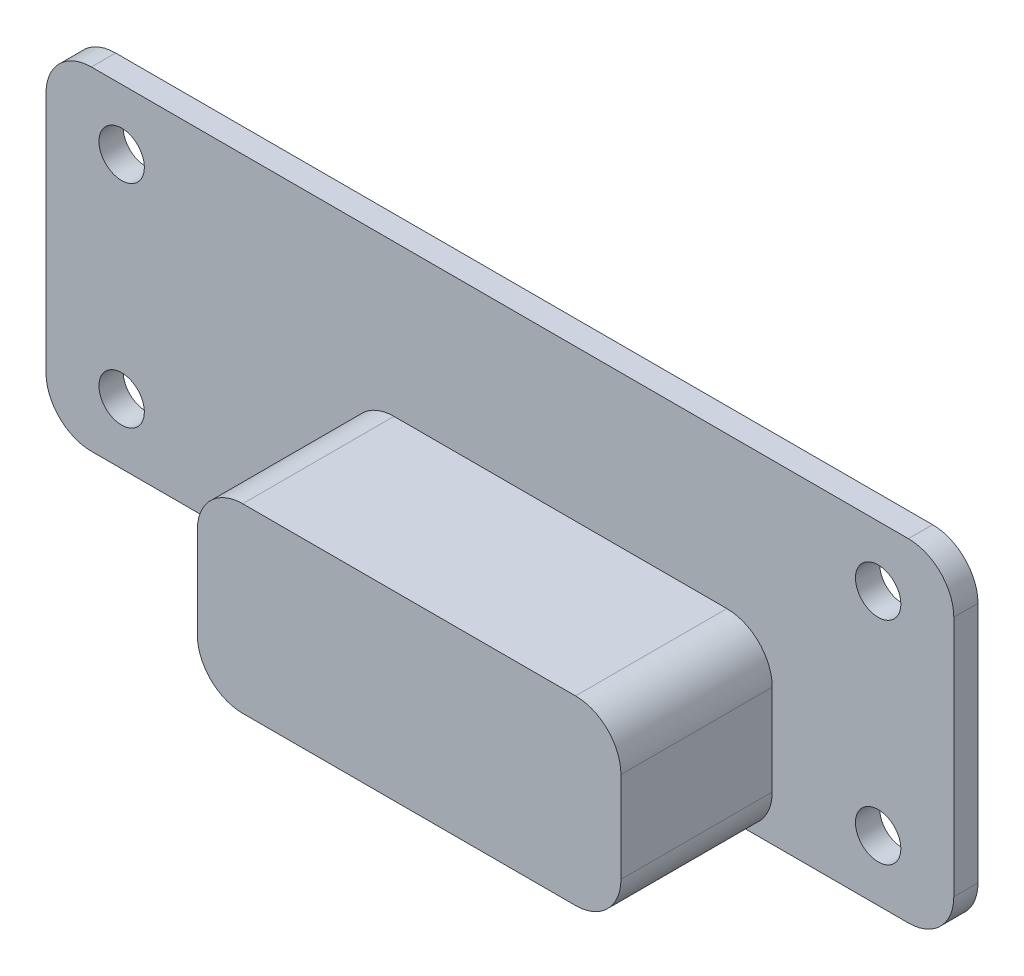
ISO-10303-21;
HEADER;
FILE_DESCRIPTION(('STEP AP214'),'2;1');
FILE_NAME('part.step','',(''),(''),'','','');
FILE_SCHEMA(('AUTOMOTIVE_DESIGN { 1 0 10303 214 1 1 1 1 }'));
ENDSEC;
DATA;
#1=APPLICATION_CONTEXT('core data for automotive mechanical design processes');
#2=APPLICATION_PROTOCOL_DEFINITION('international standard','automotive_design',2000,#1);
#3=PRODUCT_CONTEXT('',#1,'mechanical');
#4=PRODUCT('Part','Part','',(#3));
#5=PRODUCT_RELATED_PRODUCT_CATEGORY('part','',(#4));
#6=PRODUCT_DEFINITION_FORMATION('','',#4);
#7=PRODUCT_DEFINITION_CONTEXT('part definition',#1,'design');
#8=PRODUCT_DEFINITION('design','',#6,#7);
#9=PRODUCT_DEFINITION_SHAPE('','',#8);
#10=(LENGTH_UNIT() NAMED_UNIT(*) SI_UNIT(.MILLI.,.METRE.));
#11=(NAMED_UNIT(*) PLANE_ANGLE_UNIT() SI_UNIT($,.RADIAN.));
#12=(NAMED_UNIT(*) SI_UNIT($,.STERADIAN.) SOLID_ANGLE_UNIT());
#13=UNCERTAINTY_MEASURE_WITH_UNIT(LENGTH_MEASURE(1.E-05),#10,'distance_accuracy_value','');
#14=(GEOMETRIC_REPRESENTATION_CONTEXT(3) GLOBAL_UNCERTAINTY_ASSIGNED_CONTEXT((#13)) GLOBAL_UNIT_ASSIGNED_CONTEXT((#10,
#11,#12)) REPRESENTATION_CONTEXT('',''));
#15=CARTESIAN_POINT('',(0.,0.,0.));
#16=DIRECTION('',(0.,0.,1.));
#17=DIRECTION('',(1.,0.,0.));
#18=AXIS2_PLACEMENT_3D('',#15,#16,#17);
#19=CARTESIAN_POINT('',(-27.,8.,1.6));
#20=DIRECTION('',(0.,0.,1.));
#21=DIRECTION('',(1.,0.,0.));
#22=AXIS2_PLACEMENT_3D('',#19,#20,#21);
#23=PLANE('',#22);
#24=DIRECTION('',(0.,-1.,0.));
#25=VECTOR('',#24,1.);
#26=CARTESIAN_POINT('',(-10.,-11.,1.6));
#27=LINE('',#26,#25);
#28=CARTESIAN_POINT('',(-10.,-2.,1.6));
#29=VERTEX_POINT('',#28);
#30=CARTESIAN_POINT('',(-10.,-7.99999999999999,1.6));
#31=VERTEX_POINT('',#30);
#32=EDGE_CURVE('E229',#29,#31,#27,.T.);
#33=ORIENTED_EDGE('',*,*,#32,.F.);
#34=CARTESIAN_POINT('',(-7.00000000000001,-2.,1.6));
#35=DIRECTION('',(0.,0.,1.));
#36=DIRECTION('',(1.,0.,0.));
#37=AXIS2_PLACEMENT_3D('',#34,#35,#36);
#38=CIRCLE('',#37,3.);
#39=CARTESIAN_POINT('',(-7.00000000000001,0.999999999999997,1.6));
#40=VERTEX_POINT('',#39);
#41=EDGE_CURVE('E11',#29,#40,#38,.F.);
#42=ORIENTED_EDGE('',*,*,#41,.T.);
#43=DIRECTION('',(-1.,0.,0.));
#44=VECTOR('',#43,1.);
#45=CARTESIAN_POINT('',(-10.,0.999999999999997,1.6));
#46=LINE('',#45,#44);
#47=CARTESIAN_POINT('',(15.,0.999999999999997,1.6));
#48=VERTEX_POINT('',#47);
#49=EDGE_CURVE('E220',#48,#40,#46,.T.);
#50=ORIENTED_EDGE('',*,*,#49,.F.);
#51=CARTESIAN_POINT('',(15.,-2.,1.6));
#52=DIRECTION('',(0.,0.,1.));
#53=DIRECTION('',(1.,0.,0.));
#54=AXIS2_PLACEMENT_3D('',#51,#52,#53);
#55=CIRCLE('',#54,3.);
#56=CARTESIAN_POINT('',(18.,-2.,1.6));
#57=VERTEX_POINT('',#56);
#58=EDGE_CURVE('E214',#48,#57,#55,.F.);
#59=ORIENTED_EDGE('',*,*,#58,.T.);
#60=DIRECTION('',(0.,1.,0.));
#61=VECTOR('',#60,1.);
#62=CARTESIAN_POINT('',(18.,-11.,1.6));
#63=LINE('',#62,#61);
#64=CARTESIAN_POINT('',(18.,-7.99999999999999,1.6));
#65=VERTEX_POINT('',#64);
#66=EDGE_CURVE('E218',#65,#57,#63,.T.);
#67=ORIENTED_EDGE('',*,*,#66,.F.);
#68=CARTESIAN_POINT('',(15.,-7.99999999999999,1.6));
#69=DIRECTION('',(0.,0.,1.));
#70=DIRECTION('',(1.,0.,0.));
#71=AXIS2_PLACEMENT_3D('',#68,#69,#70);
#72=CIRCLE('',#71,3.);
#73=CARTESIAN_POINT('',(15.,-11.,1.6));
#74=VERTEX_POINT('',#73);
#75=EDGE_CURVE('E211',#65,#74,#72,.F.);
#76=ORIENTED_EDGE('',*,*,#75,.T.);
#77=DIRECTION('',(1.,0.,0.));
#78=VECTOR('',#77,1.);
#79=CARTESIAN_POINT('',(-27.,-11.,1.6));
#80=LINE('',#79,#78);
#81=CARTESIAN_POINT('',(27.,-11.,1.6));
#82=VERTEX_POINT('',#81);
#83=EDGE_CURVE('E276',#74,#82,#80,.T.);
#84=ORIENTED_EDGE('',*,*,#83,.T.);
#85=CARTESIAN_POINT('',(27.,-7.99999999999999,1.6));
#86=DIRECTION('',(0.,0.,1.));
#87=DIRECTION('',(1.,0.,0.));
#88=AXIS2_PLACEMENT_3D('',#85,#86,#87);
#89=CIRCLE('',#88,3.);
#90=CARTESIAN_POINT('',(30.,-7.99999999999999,1.6));
#91=VERTEX_POINT('',#90);
#92=EDGE_CURVE('E279',#82,#91,#89,.T.);
#93=ORIENTED_EDGE('',*,*,#92,.T.);
#94=DIRECTION('',(0.,1.,0.));
#95=VECTOR('',#94,1.);
#96=CARTESIAN_POINT('',(30.,-8.00000000000001,1.6));
#97=LINE('',#96,#95);
#98=CARTESIAN_POINT('',(30.,8.00000000000001,1.6));
#99=VERTEX_POINT('',#98);
#100=EDGE_CURVE('E281',#91,#99,#97,.T.);
#101=ORIENTED_EDGE('',*,*,#100,.T.);
#102=CARTESIAN_POINT('',(27.,8.00000000000001,1.6));
#103=DIRECTION('',(0.,0.,1.));
#104=DIRECTION('',(1.,0.,0.));
#105=AXIS2_PLACEMENT_3D('',#102,#103,#104);
#106=CIRCLE('',#105,3.);
#107=CARTESIAN_POINT('',(27.,11.,1.6));
#108=VERTEX_POINT('',#107);
#109=EDGE_CURVE('E283',#99,#108,#106,.T.);
#110=ORIENTED_EDGE('',*,*,#109,.T.);
#111=DIRECTION('',(-1.,0.,0.));
#112=VECTOR('',#111,1.);
#113=CARTESIAN_POINT('',(27.,11.,1.6));
#114=LINE('',#113,#112);
#115=CARTESIAN_POINT('',(-27.,11.,1.6));
#116=VERTEX_POINT('',#115);
#117=EDGE_CURVE('E170',#108,#116,#114,.T.);
#118=ORIENTED_EDGE('',*,*,#117,.T.);
#119=CARTESIAN_POINT('',(-27.,8.,1.6));
#120=DIRECTION('',(0.,0.,1.));
#121=DIRECTION('',(1.,0.,0.));
#122=AXIS2_PLACEMENT_3D('',#119,#120,#121);
#123=CIRCLE('',#122,3.);
#124=CARTESIAN_POINT('',(-30.,8.,1.6));
#125=VERTEX_POINT('',#124);
#126=EDGE_CURVE('E165',#116,#125,#123,.T.);
#127=ORIENTED_EDGE('',*,*,#126,.T.);
#128=DIRECTION('',(0.,-1.,0.));
#129=VECTOR('',#128,1.);
#130=CARTESIAN_POINT('',(-30.,8.,1.6));
#131=LINE('',#130,#129);
#132=CARTESIAN_POINT('',(-30.,-8.00000000000001,1.6));
#133=VERTEX_POINT('',#132);
#134=EDGE_CURVE('E155',#125,#133,#131,.T.);
#135=ORIENTED_EDGE('',*,*,#134,.T.);
#136=CARTESIAN_POINT('',(-27.,-8.,1.6));
#137=DIRECTION('',(0.,0.,1.));
#138=DIRECTION('',(1.,0.,0.));
#139=AXIS2_PLACEMENT_3D('',#136,#137,#138);
#140=CIRCLE('',#139,3.);
#141=CARTESIAN_POINT('',(-27.,-11.,1.6));
#142=VERTEX_POINT('',#141);
#143=EDGE_CURVE('E164',#133,#142,#140,.T.);
#144=ORIENTED_EDGE('',*,*,#143,.T.);
#145=CARTESIAN_POINT('',(-7.00000000000001,-11.,1.6));
#146=VERTEX_POINT('',#145);
#147=EDGE_CURVE('E277',#142,#146,#80,.T.);
#148=ORIENTED_EDGE('',*,*,#147,.T.);
#149=CARTESIAN_POINT('',(-7.00000000000001,-7.99999999999999,1.6));
#150=DIRECTION('',(0.,0.,1.));
#151=DIRECTION('',(1.,0.,0.));
#152=AXIS2_PLACEMENT_3D('',#149,#150,#151);
#153=CIRCLE('',#152,3.);
#154=EDGE_CURVE('E51',#146,#31,#153,.F.);
#155=ORIENTED_EDGE('',*,*,#154,.T.);
#156=EDGE_LOOP('',(#33,#42,#50,#59,#67,#76,#84,#93,#101,#110,#118,#127,#135,#144,#148,#155));
#157=FACE_BOUND('',#156,.T.);
#158=CARTESIAN_POINT('',(25.,-7.,1.6));
#159=DIRECTION('',(0.,0.,1.));
#160=DIRECTION('',(1.,0.,0.));
#161=AXIS2_PLACEMENT_3D('',#158,#159,#160);
#162=CIRCLE('',#161,1.5);
#163=CARTESIAN_POINT('',(26.5,-7.,1.6));
#164=VERTEX_POINT('',#163);
#165=EDGE_CURVE('E258',#164,#164,#162,.T.);
#166=ORIENTED_EDGE('',*,*,#165,.F.);
#167=EDGE_LOOP('',(#166));
#168=FACE_BOUND('',#167,.T.);
#169=CARTESIAN_POINT('',(-25.,7.,1.6));
#170=DIRECTION('',(0.,0.,1.));
#171=DIRECTION('',(1.,0.,0.));
#172=AXIS2_PLACEMENT_3D('',#169,#170,#171);
#173=CIRCLE('',#172,1.5);
#174=CARTESIAN_POINT('',(-23.5,7.,1.6));
#175=VERTEX_POINT('',#174);
#176=EDGE_CURVE('E270',#175,#175,#173,.T.);
#177=ORIENTED_EDGE('',*,*,#176,.F.);
#178=EDGE_LOOP('',(#177));
#179=FACE_BOUND('',#178,.T.);
#180=CARTESIAN_POINT('',(25.,7.,1.6));
#181=DIRECTION('',(0.,0.,1.));
#182=DIRECTION('',(1.,0.,0.));
#183=AXIS2_PLACEMENT_3D('',#180,#181,#182);
#184=CIRCLE('',#183,1.5);
#185=CARTESIAN_POINT('',(26.5,7.,1.6));
#186=VERTEX_POINT('',#185);
#187=EDGE_CURVE('E264',#186,#186,#184,.T.);
#188=ORIENTED_EDGE('',*,*,#187,.F.);
#189=EDGE_LOOP('',(#188));
#190=FACE_BOUND('',#189,.T.);
#191=CARTESIAN_POINT('',(-25.,-7.,1.6));
#192=DIRECTION('',(0.,0.,1.));
#193=DIRECTION('',(1.,0.,0.));
#194=AXIS2_PLACEMENT_3D('',#191,#192,#193);
#195=CIRCLE('',#194,1.5);
#196=CARTESIAN_POINT('',(-23.5,-7.,1.6));
#197=VERTEX_POINT('',#196);
#198=EDGE_CURVE('E246',#197,#197,#195,.T.);
#199=ORIENTED_EDGE('',*,*,#198,.F.);
#200=EDGE_LOOP('',(#199));
#201=FACE_BOUND('',#200,.T.);
#202=ADVANCED_FACE('F43',(#157,#168,#179,#190,#201),#23,.T.);
#203=CARTESIAN_POINT('',(-27.,8.,0.));
#204=DIRECTION('',(0.,0.,1.));
#205=DIRECTION('',(1.,0.,0.));
#206=AXIS2_PLACEMENT_3D('',#203,#204,#205);
#207=PLANE('',#206);
#208=CARTESIAN_POINT('',(-27.,8.,0.));
#209=DIRECTION('',(0.,0.,1.));
#210=DIRECTION('',(1.,0.,0.));
#211=AXIS2_PLACEMENT_3D('',#208,#209,#210);
#212=CIRCLE('',#211,3.);
#213=CARTESIAN_POINT('',(-27.,11.,0.));
#214=VERTEX_POINT('',#213);
#215=CARTESIAN_POINT('',(-30.,8.,0.));
#216=VERTEX_POINT('',#215);
#217=EDGE_CURVE('E178',#214,#216,#212,.T.);
#218=ORIENTED_EDGE('',*,*,#217,.F.);
#219=DIRECTION('',(-1.,0.,0.));
#220=VECTOR('',#219,1.);
#221=CARTESIAN_POINT('',(27.,11.,0.));
#222=LINE('',#221,#220);
#223=CARTESIAN_POINT('',(27.,11.,0.));
#224=VERTEX_POINT('',#223);
#225=EDGE_CURVE('E174',#224,#214,#222,.T.);
#226=ORIENTED_EDGE('',*,*,#225,.F.);
#227=CARTESIAN_POINT('',(27.,8.00000000000001,0.));
#228=DIRECTION('',(0.,0.,1.));
#229=DIRECTION('',(1.,0.,0.));
#230=AXIS2_PLACEMENT_3D('',#227,#228,#229);
#231=CIRCLE('',#230,3.);
#232=CARTESIAN_POINT('',(30.,8.00000000000001,0.));
#233=VERTEX_POINT('',#232);
#234=EDGE_CURVE('E298',#233,#224,#231,.T.);
#235=ORIENTED_EDGE('',*,*,#234,.F.);
#236=DIRECTION('',(0.,1.,0.));
#237=VECTOR('',#236,1.);
#238=CARTESIAN_POINT('',(30.,-8.00000000000001,0.));
#239=LINE('',#238,#237);
#240=CARTESIAN_POINT('',(30.,-7.99999999999999,0.));
#241=VERTEX_POINT('',#240);
#242=EDGE_CURVE('E296',#241,#233,#239,.T.);
#243=ORIENTED_EDGE('',*,*,#242,.F.);
#244=CARTESIAN_POINT('',(27.,-7.99999999999999,0.));
#245=DIRECTION('',(0.,0.,1.));
#246=DIRECTION('',(1.,0.,0.));
#247=AXIS2_PLACEMENT_3D('',#244,#245,#246);
#248=CIRCLE('',#247,3.);
#249=CARTESIAN_POINT('',(27.,-11.,0.));
#250=VERTEX_POINT('',#249);
#251=EDGE_CURVE('E294',#250,#241,#248,.T.);
#252=ORIENTED_EDGE('',*,*,#251,.F.);
#253=DIRECTION('',(1.,0.,0.));
#254=VECTOR('',#253,1.);
#255=CARTESIAN_POINT('',(-27.,-11.,0.));
#256=LINE('',#255,#254);
#257=CARTESIAN_POINT('',(-27.,-11.,0.));
#258=VERTEX_POINT('',#257);
#259=EDGE_CURVE('E292',#258,#250,#256,.T.);
#260=ORIENTED_EDGE('',*,*,#259,.F.);
#261=CARTESIAN_POINT('',(-27.,-8.,0.));
#262=DIRECTION('',(0.,0.,1.));
#263=DIRECTION('',(1.,0.,0.));
#264=AXIS2_PLACEMENT_3D('',#261,#262,#263);
#265=CIRCLE('',#264,3.);
#266=CARTESIAN_POINT('',(-30.,-8.00000000000001,0.));
#267=VERTEX_POINT('',#266);
#268=EDGE_CURVE('E290',#267,#258,#265,.T.);
#269=ORIENTED_EDGE('',*,*,#268,.F.);
#270=DIRECTION('',(0.,-1.,0.));
#271=VECTOR('',#270,1.);
#272=CARTESIAN_POINT('',(-30.,8.,0.));
#273=LINE('',#272,#271);
#274=EDGE_CURVE('E288',#216,#267,#273,.T.);
#275=ORIENTED_EDGE('',*,*,#274,.F.);
#276=EDGE_LOOP('',(#218,#226,#235,#243,#252,#260,#269,#275));
#277=FACE_BOUND('',#276,.T.);
#278=CARTESIAN_POINT('',(-25.,7.,0.));
#279=DIRECTION('',(0.,0.,1.));
#280=DIRECTION('',(1.,0.,0.));
#281=AXIS2_PLACEMENT_3D('',#278,#279,#280);
#282=CIRCLE('',#281,1.5);
#283=CARTESIAN_POINT('',(-23.5,7.,0.));
#284=VERTEX_POINT('',#283);
#285=EDGE_CURVE('E267',#284,#284,#282,.T.);
#286=ORIENTED_EDGE('',*,*,#285,.T.);
#287=EDGE_LOOP('',(#286));
#288=FACE_BOUND('',#287,.T.);
#289=CARTESIAN_POINT('',(25.,7.,0.));
#290=DIRECTION('',(0.,0.,1.));
#291=DIRECTION('',(1.,0.,0.));
#292=AXIS2_PLACEMENT_3D('',#289,#290,#291);
#293=CIRCLE('',#292,1.5);
#294=CARTESIAN_POINT('',(26.5,7.,0.));
#295=VERTEX_POINT('',#294);
#296=EDGE_CURVE('E261',#295,#295,#293,.T.);
#297=ORIENTED_EDGE('',*,*,#296,.T.);
#298=EDGE_LOOP('',(#297));
#299=FACE_BOUND('',#298,.T.);
#300=CARTESIAN_POINT('',(25.,-7.,0.));
#301=DIRECTION('',(0.,0.,1.));
#302=DIRECTION('',(1.,0.,0.));
#303=AXIS2_PLACEMENT_3D('',#300,#301,#302);
#304=CIRCLE('',#303,1.5);
#305=CARTESIAN_POINT('',(26.5,-7.,0.));
#306=VERTEX_POINT('',#305);
#307=EDGE_CURVE('E256',#306,#306,#304,.T.);
#308=ORIENTED_EDGE('',*,*,#307,.T.);
#309=EDGE_LOOP('',(#308));
#310=FACE_BOUND('',#309,.T.);
#311=CARTESIAN_POINT('',(-25.,-7.,0.));
#312=DIRECTION('',(0.,0.,1.));
#313=DIRECTION('',(1.,0.,0.));
#314=AXIS2_PLACEMENT_3D('',#311,#312,#313);
#315=CIRCLE('',#314,1.5);
#316=CARTESIAN_POINT('',(-23.5,-7.,0.));
#317=VERTEX_POINT('',#316);
#318=EDGE_CURVE('E243',#317,#317,#315,.T.);
#319=ORIENTED_EDGE('',*,*,#318,.T.);
#320=EDGE_LOOP('',(#319));
#321=FACE_BOUND('',#320,.T.);
#322=ADVANCED_FACE('F324',(#277,#288,#299,#310,#321),#207,.F.);
#323=CARTESIAN_POINT('',(-27.,8.,1.6));
#324=DIRECTION('',(0.,0.,-1.));
#325=DIRECTION('',(-1.,0.,0.));
#326=AXIS2_PLACEMENT_3D('',#323,#324,#325);
#327=CYLINDRICAL_SURFACE('',#326,3.);
#328=ORIENTED_EDGE('',*,*,#217,.T.);
#329=DIRECTION('',(0.,0.,-1.));
#330=VECTOR('',#329,1.);
#331=CARTESIAN_POINT('',(-30.,8.,1.6));
#332=LINE('',#331,#330);
#333=EDGE_CURVE('E159',#125,#216,#332,.T.);
#334=ORIENTED_EDGE('',*,*,#333,.F.);
#335=ORIENTED_EDGE('',*,*,#126,.F.);
#336=DIRECTION('',(0.,0.,-1.));
#337=VECTOR('',#336,1.);
#338=CARTESIAN_POINT('',(-27.,11.,1.6));
#339=LINE('',#338,#337);
#340=EDGE_CURVE('E286',#116,#214,#339,.T.);
#341=ORIENTED_EDGE('',*,*,#340,.T.);
#342=EDGE_LOOP('',(#328,#334,#335,#341));
#343=FACE_BOUND('',#342,.T.);
#344=ADVANCED_FACE('F176',(#343),#327,.T.);
#345=CARTESIAN_POINT('',(-30.,8.,1.6));
#346=DIRECTION('',(1.,0.,0.));
#347=DIRECTION('',(0.,0.,-1.));
#348=AXIS2_PLACEMENT_3D('',#345,#346,#347);
#349=PLANE('',#348);
#350=ORIENTED_EDGE('',*,*,#274,.T.);
#351=DIRECTION('',(0.,0.,-1.));
#352=VECTOR('',#351,1.);
#353=CARTESIAN_POINT('',(-30.,-8.00000000000001,1.6));
#354=LINE('',#353,#352);
#355=EDGE_CURVE('E162',#133,#267,#354,.T.);
#356=ORIENTED_EDGE('',*,*,#355,.F.);
#357=ORIENTED_EDGE('',*,*,#134,.F.);
#358=ORIENTED_EDGE('',*,*,#333,.T.);
#359=EDGE_LOOP('',(#350,#356,#357,#358));
#360=FACE_BOUND('',#359,.T.);
#361=ADVANCED_FACE('F157',(#360),#349,.F.);
#362=CARTESIAN_POINT('',(-27.,-8.,1.6));
#363=DIRECTION('',(0.,0.,-1.));
#364=DIRECTION('',(-1.,0.,0.));
#365=AXIS2_PLACEMENT_3D('',#362,#363,#364);
#366=CYLINDRICAL_SURFACE('',#365,3.);
#367=ORIENTED_EDGE('',*,*,#268,.T.);
#368=DIRECTION('',(0.,0.,-1.));
#369=VECTOR('',#368,1.);
#370=CARTESIAN_POINT('',(-27.,-11.,1.6));
#371=LINE('',#370,#369);
#372=EDGE_CURVE('E183',#142,#258,#371,.T.);
#373=ORIENTED_EDGE('',*,*,#372,.F.);
#374=ORIENTED_EDGE('',*,*,#143,.F.);
#375=ORIENTED_EDGE('',*,*,#355,.T.);
#376=EDGE_LOOP('',(#367,#373,#374,#375));
#377=FACE_BOUND('',#376,.T.);
#378=ADVANCED_FACE('F381',(#377),#366,.T.);
#379=CARTESIAN_POINT('',(-27.,-11.,1.6));
#380=DIRECTION('',(0.,1.,0.));
#381=DIRECTION('',(-1.,0.,0.));
#382=AXIS2_PLACEMENT_3D('',#379,#380,#381);
#383=PLANE('',#382);
#384=ORIENTED_EDGE('',*,*,#83,.F.);
#385=DIRECTION('',(0.,0.,-1.));
#386=VECTOR('',#385,1.);
#387=CARTESIAN_POINT('',(15.,-11.,1.6));
#388=LINE('',#387,#386);
#389=CARTESIAN_POINT('',(15.,-11.,11.6));
#390=VERTEX_POINT('',#389);
#391=EDGE_CURVE('E192',#74,#390,#388,.F.);
#392=ORIENTED_EDGE('',*,*,#391,.T.);
#393=DIRECTION('',(1.,0.,0.));
#394=VECTOR('',#393,1.);
#395=CARTESIAN_POINT('',(-10.,-11.,11.6));
#396=LINE('',#395,#394);
#397=CARTESIAN_POINT('',(-7.00000000000001,-11.,11.6));
#398=VERTEX_POINT('',#397);
#399=EDGE_CURVE('E248',#398,#390,#396,.T.);
#400=ORIENTED_EDGE('',*,*,#399,.F.);
#401=DIRECTION('',(0.,0.,-1.));
#402=VECTOR('',#401,1.);
#403=CARTESIAN_POINT('',(-7.00000000000001,-11.,1.6));
#404=LINE('',#403,#402);
#405=EDGE_CURVE('E189',#398,#146,#404,.T.);
#406=ORIENTED_EDGE('',*,*,#405,.T.);
#407=ORIENTED_EDGE('',*,*,#147,.F.);
#408=ORIENTED_EDGE('',*,*,#372,.T.);
#409=ORIENTED_EDGE('',*,*,#259,.T.);
#410=DIRECTION('',(0.,0.,-1.));
#411=VECTOR('',#410,1.);
#412=CARTESIAN_POINT('',(27.,-11.,1.6));
#413=LINE('',#412,#411);
#414=EDGE_CURVE('E311',#82,#250,#413,.T.);
#415=ORIENTED_EDGE('',*,*,#414,.F.);
#416=EDGE_LOOP('',(#384,#392,#400,#406,#407,#408,#409,#415));
#417=FACE_BOUND('',#416,.T.);
#418=ADVANCED_FACE('F318',(#417),#383,.F.);
#419=CARTESIAN_POINT('',(27.,-7.99999999999999,1.6));
#420=DIRECTION('',(0.,0.,-1.));
#421=DIRECTION('',(-1.,0.,0.));
#422=AXIS2_PLACEMENT_3D('',#419,#420,#421);
#423=CYLINDRICAL_SURFACE('',#422,3.);
#424=ORIENTED_EDGE('',*,*,#251,.T.);
#425=DIRECTION('',(0.,0.,-1.));
#426=VECTOR('',#425,1.);
#427=CARTESIAN_POINT('',(30.,-7.99999999999999,1.6));
#428=LINE('',#427,#426);
#429=EDGE_CURVE('E308',#91,#241,#428,.T.);
#430=ORIENTED_EDGE('',*,*,#429,.F.);
#431=ORIENTED_EDGE('',*,*,#92,.F.);
#432=ORIENTED_EDGE('',*,*,#414,.T.);
#433=EDGE_LOOP('',(#424,#430,#431,#432));
#434=FACE_BOUND('',#433,.T.);
#435=ADVANCED_FACE('F330',(#434),#423,.T.);
#436=CARTESIAN_POINT('',(30.,-8.00000000000001,1.6));
#437=DIRECTION('',(-1.,0.,0.));
#438=DIRECTION('',(0.,0.,1.));
#439=AXIS2_PLACEMENT_3D('',#436,#437,#438);
#440=PLANE('',#439);
#441=ORIENTED_EDGE('',*,*,#242,.T.);
#442=DIRECTION('',(0.,0.,-1.));
#443=VECTOR('',#442,1.);
#444=CARTESIAN_POINT('',(30.,8.00000000000001,1.6));
#445=LINE('',#444,#443);
#446=EDGE_CURVE('E305',#99,#233,#445,.T.);
#447=ORIENTED_EDGE('',*,*,#446,.F.);
#448=ORIENTED_EDGE('',*,*,#100,.F.);
#449=ORIENTED_EDGE('',*,*,#429,.T.);
#450=EDGE_LOOP('',(#441,#447,#448,#449));
#451=FACE_BOUND('',#450,.T.);
#452=ADVANCED_FACE('F334',(#451),#440,.F.);
#453=CARTESIAN_POINT('',(27.,8.00000000000001,1.6));
#454=DIRECTION('',(0.,0.,-1.));
#455=DIRECTION('',(-1.,0.,0.));
#456=AXIS2_PLACEMENT_3D('',#453,#454,#455);
#457=CYLINDRICAL_SURFACE('',#456,3.);
#458=ORIENTED_EDGE('',*,*,#234,.T.);
#459=DIRECTION('',(0.,0.,-1.));
#460=VECTOR('',#459,1.);
#461=CARTESIAN_POINT('',(27.,11.,1.6));
#462=LINE('',#461,#460);
#463=EDGE_CURVE('E302',#108,#224,#462,.T.);
#464=ORIENTED_EDGE('',*,*,#463,.F.);
#465=ORIENTED_EDGE('',*,*,#109,.F.);
#466=ORIENTED_EDGE('',*,*,#446,.T.);
#467=EDGE_LOOP('',(#458,#464,#465,#466));
#468=FACE_BOUND('',#467,.T.);
#469=ADVANCED_FACE('F371',(#468),#457,.T.);
#470=CARTESIAN_POINT('',(27.,11.,1.6));
#471=DIRECTION('',(0.,-1.,0.));
#472=DIRECTION('',(1.,0.,0.));
#473=AXIS2_PLACEMENT_3D('',#470,#471,#472);
#474=PLANE('',#473);
#475=ORIENTED_EDGE('',*,*,#225,.T.);
#476=ORIENTED_EDGE('',*,*,#340,.F.);
#477=ORIENTED_EDGE('',*,*,#117,.F.);
#478=ORIENTED_EDGE('',*,*,#463,.T.);
#479=EDGE_LOOP('',(#475,#476,#477,#478));
#480=FACE_BOUND('',#479,.T.);
#481=ADVANCED_FACE('F368',(#480),#474,.F.);
#482=CARTESIAN_POINT('',(-25.,7.,1.6));
#483=DIRECTION('',(0.,0.,-1.));
#484=DIRECTION('',(-1.,0.,0.));
#485=AXIS2_PLACEMENT_3D('',#482,#483,#484);
#486=CYLINDRICAL_SURFACE('',#485,1.5);
#487=ORIENTED_EDGE('',*,*,#176,.T.);
#488=EDGE_LOOP('',(#487));
#489=FACE_BOUND('',#488,.T.);
#490=ORIENTED_EDGE('',*,*,#285,.F.);
#491=EDGE_LOOP('',(#490));
#492=FACE_BOUND('',#491,.T.);
#493=ADVANCED_FACE('F365',(#489,#492),#486,.F.);
#494=CARTESIAN_POINT('',(25.,7.,1.6));
#495=DIRECTION('',(0.,0.,-1.));
#496=DIRECTION('',(-1.,0.,0.));
#497=AXIS2_PLACEMENT_3D('',#494,#495,#496);
#498=CYLINDRICAL_SURFACE('',#497,1.5);
#499=ORIENTED_EDGE('',*,*,#187,.T.);
#500=EDGE_LOOP('',(#499));
#501=FACE_BOUND('',#500,.T.);
#502=ORIENTED_EDGE('',*,*,#296,.F.);
#503=EDGE_LOOP('',(#502));
#504=FACE_BOUND('',#503,.T.);
#505=ADVANCED_FACE('F428',(#501,#504),#498,.F.);
#506=CARTESIAN_POINT('',(25.,-7.,1.6));
#507=DIRECTION('',(0.,0.,-1.));
#508=DIRECTION('',(-1.,0.,0.));
#509=AXIS2_PLACEMENT_3D('',#506,#507,#508);
#510=CYLINDRICAL_SURFACE('',#509,1.5);
#511=ORIENTED_EDGE('',*,*,#165,.T.);
#512=EDGE_LOOP('',(#511));
#513=FACE_BOUND('',#512,.T.);
#514=ORIENTED_EDGE('',*,*,#307,.F.);
#515=EDGE_LOOP('',(#514));
#516=FACE_BOUND('',#515,.T.);
#517=ADVANCED_FACE('F436',(#513,#516),#510,.F.);
#518=CARTESIAN_POINT('',(-25.,-7.,1.6));
#519=DIRECTION('',(0.,0.,-1.));
#520=DIRECTION('',(-1.,0.,0.));
#521=AXIS2_PLACEMENT_3D('',#518,#519,#520);
#522=CYLINDRICAL_SURFACE('',#521,1.5);
#523=ORIENTED_EDGE('',*,*,#198,.T.);
#524=EDGE_LOOP('',(#523));
#525=FACE_BOUND('',#524,.T.);
#526=ORIENTED_EDGE('',*,*,#318,.F.);
#527=EDGE_LOOP('',(#526));
#528=FACE_BOUND('',#527,.T.);
#529=ADVANCED_FACE('F443',(#525,#528),#522,.F.);
#530=CARTESIAN_POINT('',(-10.,-11.,11.6));
#531=DIRECTION('',(1.,0.,0.));
#532=DIRECTION('',(0.,0.,-1.));
#533=AXIS2_PLACEMENT_3D('',#530,#531,#532);
#534=PLANE('',#533);
#535=ORIENTED_EDGE('',*,*,#32,.T.);
#536=DIRECTION('',(0.,0.,-1.));
#537=VECTOR('',#536,1.);
#538=CARTESIAN_POINT('',(-10.,-7.99999999999999,11.6));
#539=LINE('',#538,#537);
#540=CARTESIAN_POINT('',(-10.,-7.99999999999999,11.6));
#541=VERTEX_POINT('',#540);
#542=EDGE_CURVE('E209',#31,#541,#539,.F.);
#543=ORIENTED_EDGE('',*,*,#542,.T.);
#544=DIRECTION('',(0.,-1.,0.));
#545=VECTOR('',#544,1.);
#546=CARTESIAN_POINT('',(-10.,-11.,11.6));
#547=LINE('',#546,#545);
#548=CARTESIAN_POINT('',(-10.,-2.,11.6));
#549=VERTEX_POINT('',#548);
#550=EDGE_CURVE('E254',#549,#541,#547,.T.);
#551=ORIENTED_EDGE('',*,*,#550,.F.);
#552=DIRECTION('',(0.,0.,-1.));
#553=VECTOR('',#552,1.);
#554=CARTESIAN_POINT('',(-10.,-2.,11.6));
#555=LINE('',#554,#553);
#556=EDGE_CURVE('E207',#549,#29,#555,.T.);
#557=ORIENTED_EDGE('',*,*,#556,.T.);
#558=EDGE_LOOP('',(#535,#543,#551,#557));
#559=FACE_BOUND('',#558,.T.);
#560=ADVANCED_FACE('F451',(#559),#534,.F.);
#561=CARTESIAN_POINT('',(18.,-11.,11.6));
#562=DIRECTION('',(-1.,0.,0.));
#563=DIRECTION('',(0.,0.,1.));
#564=AXIS2_PLACEMENT_3D('',#561,#562,#563);
#565=PLANE('',#564);
#566=DIRECTION('',(0.,1.,0.));
#567=VECTOR('',#566,1.);
#568=CARTESIAN_POINT('',(18.,-11.,11.6));
#569=LINE('',#568,#567);
#570=CARTESIAN_POINT('',(18.,-7.99999999999999,11.6));
#571=VERTEX_POINT('',#570);
#572=CARTESIAN_POINT('',(18.,-2.,11.6));
#573=VERTEX_POINT('',#572);
#574=EDGE_CURVE('E240',#571,#573,#569,.T.);
#575=ORIENTED_EDGE('',*,*,#574,.F.);
#576=DIRECTION('',(0.,0.,-1.));
#577=VECTOR('',#576,1.);
#578=CARTESIAN_POINT('',(18.,-7.99999999999999,11.6));
#579=LINE('',#578,#577);
#580=EDGE_CURVE('E181',#571,#65,#579,.T.);
#581=ORIENTED_EDGE('',*,*,#580,.T.);
#582=ORIENTED_EDGE('',*,*,#66,.T.);
#583=DIRECTION('',(0.,0.,-1.));
#584=VECTOR('',#583,1.);
#585=CARTESIAN_POINT('',(18.,-2.,11.6));
#586=LINE('',#585,#584);
#587=EDGE_CURVE('E179',#57,#573,#586,.F.);
#588=ORIENTED_EDGE('',*,*,#587,.T.);
#589=EDGE_LOOP('',(#575,#581,#582,#588));
#590=FACE_BOUND('',#589,.T.);
#591=ADVANCED_FACE('F226',(#590),#565,.F.);
#592=CARTESIAN_POINT('',(-10.,0.999999999999997,11.6));
#593=DIRECTION('',(0.,-1.,0.));
#594=DIRECTION('',(0.,0.,-1.));
#595=AXIS2_PLACEMENT_3D('',#592,#593,#594);
#596=PLANE('',#595);
#597=DIRECTION('',(-1.,0.,0.));
#598=VECTOR('',#597,1.);
#599=CARTESIAN_POINT('',(-10.,0.999999999999997,11.6));
#600=LINE('',#599,#598);
#601=CARTESIAN_POINT('',(15.,0.999999999999997,11.6));
#602=VERTEX_POINT('',#601);
#603=CARTESIAN_POINT('',(-7.00000000000001,0.999999999999997,11.6));
#604=VERTEX_POINT('',#603);
#605=EDGE_CURVE('E238',#602,#604,#600,.T.);
#606=ORIENTED_EDGE('',*,*,#605,.F.);
#607=DIRECTION('',(0.,0.,-1.));
#608=VECTOR('',#607,1.);
#609=CARTESIAN_POINT('',(15.,0.999999999999997,11.6));
#610=LINE('',#609,#608);
#611=EDGE_CURVE('E204',#602,#48,#610,.T.);
#612=ORIENTED_EDGE('',*,*,#611,.T.);
#613=ORIENTED_EDGE('',*,*,#49,.T.);
#614=DIRECTION('',(0.,0.,-1.));
#615=VECTOR('',#614,1.);
#616=CARTESIAN_POINT('',(-7.00000000000001,0.999999999999997,11.6));
#617=LINE('',#616,#615);
#618=EDGE_CURVE('E202',#40,#604,#617,.F.);
#619=ORIENTED_EDGE('',*,*,#618,.T.);
#620=EDGE_LOOP('',(#606,#612,#613,#619));
#621=FACE_BOUND('',#620,.T.);
#622=ADVANCED_FACE('F242',(#621),#596,.F.);
#623=CARTESIAN_POINT('',(0.,0.,11.6));
#624=DIRECTION('',(0.,0.,-1.));
#625=DIRECTION('',(-1.,0.,0.));
#626=AXIS2_PLACEMENT_3D('',#623,#624,#625);
#627=PLANE('',#626);
#628=ORIENTED_EDGE('',*,*,#399,.T.);
#629=CARTESIAN_POINT('',(15.,-7.99999999999999,11.6));
#630=DIRECTION('',(0.,0.,-1.));
#631=DIRECTION('',(-1.,0.,0.));
#632=AXIS2_PLACEMENT_3D('',#629,#630,#631);
#633=CIRCLE('',#632,3.);
#634=EDGE_CURVE('E200',#390,#571,#633,.F.);
#635=ORIENTED_EDGE('',*,*,#634,.T.);
#636=ORIENTED_EDGE('',*,*,#574,.T.);
#637=CARTESIAN_POINT('',(15.,-2.,11.6));
#638=DIRECTION('',(0.,0.,-1.));
#639=DIRECTION('',(-1.,0.,0.));
#640=AXIS2_PLACEMENT_3D('',#637,#638,#639);
#641=CIRCLE('',#640,3.);
#642=EDGE_CURVE('E198',#573,#602,#641,.F.);
#643=ORIENTED_EDGE('',*,*,#642,.T.);
#644=ORIENTED_EDGE('',*,*,#605,.T.);
#645=CARTESIAN_POINT('',(-7.00000000000001,-2.,11.6));
#646=DIRECTION('',(0.,0.,-1.));
#647=DIRECTION('',(-1.,0.,0.));
#648=AXIS2_PLACEMENT_3D('',#645,#646,#647);
#649=CIRCLE('',#648,3.);
#650=EDGE_CURVE('E194',#604,#549,#649,.F.);
#651=ORIENTED_EDGE('',*,*,#650,.T.);
#652=ORIENTED_EDGE('',*,*,#550,.T.);
#653=CARTESIAN_POINT('',(-7.00000000000001,-7.99999999999999,11.6));
#654=DIRECTION('',(0.,0.,-1.));
#655=DIRECTION('',(-1.,0.,0.));
#656=AXIS2_PLACEMENT_3D('',#653,#654,#655);
#657=CIRCLE('',#656,3.);
#658=EDGE_CURVE('E196',#541,#398,#657,.F.);
#659=ORIENTED_EDGE('',*,*,#658,.T.);
#660=EDGE_LOOP('',(#628,#635,#636,#643,#644,#651,#652,#659));
#661=FACE_BOUND('',#660,.T.);
#662=ADVANCED_FACE('F237',(#661),#627,.F.);
#663=CARTESIAN_POINT('',(15.,-7.99999999999999,11.6));
#664=DIRECTION('',(0.,0.,-1.));
#665=DIRECTION('',(-1.,0.,0.));
#666=AXIS2_PLACEMENT_3D('',#663,#664,#665);
#667=CYLINDRICAL_SURFACE('',#666,3.);
#668=ORIENTED_EDGE('',*,*,#634,.F.);
#669=ORIENTED_EDGE('',*,*,#391,.F.);
#670=ORIENTED_EDGE('',*,*,#75,.F.);
#671=ORIENTED_EDGE('',*,*,#580,.F.);
#672=EDGE_LOOP('',(#668,#669,#670,#671));
#673=FACE_BOUND('',#672,.T.);
#674=ADVANCED_FACE('F345',(#673),#667,.T.);
#675=CARTESIAN_POINT('',(15.,-2.,11.6));
#676=DIRECTION('',(0.,0.,-1.));
#677=DIRECTION('',(-1.,0.,0.));
#678=AXIS2_PLACEMENT_3D('',#675,#676,#677);
#679=CYLINDRICAL_SURFACE('',#678,3.);
#680=ORIENTED_EDGE('',*,*,#642,.F.);
#681=ORIENTED_EDGE('',*,*,#587,.F.);
#682=ORIENTED_EDGE('',*,*,#58,.F.);
#683=ORIENTED_EDGE('',*,*,#611,.F.);
#684=EDGE_LOOP('',(#680,#681,#682,#683));
#685=FACE_BOUND('',#684,.T.);
#686=ADVANCED_FACE('F232',(#685),#679,.T.);
#687=CARTESIAN_POINT('',(-7.00000000000001,-7.99999999999999,1.6));
#688=DIRECTION('',(0.,0.,-1.));
#689=DIRECTION('',(-1.,0.,0.));
#690=AXIS2_PLACEMENT_3D('',#687,#688,#689);
#691=CYLINDRICAL_SURFACE('',#690,3.);
#692=ORIENTED_EDGE('',*,*,#658,.F.);
#693=ORIENTED_EDGE('',*,*,#542,.F.);
#694=ORIENTED_EDGE('',*,*,#154,.F.);
#695=ORIENTED_EDGE('',*,*,#405,.F.);
#696=EDGE_LOOP('',(#692,#693,#694,#695));
#697=FACE_BOUND('',#696,.T.);
#698=ADVANCED_FACE('F352',(#697),#691,.T.);
#699=CARTESIAN_POINT('',(-7.00000000000001,-2.,11.6));
#700=DIRECTION('',(0.,0.,-1.));
#701=DIRECTION('',(-1.,0.,0.));
#702=AXIS2_PLACEMENT_3D('',#699,#700,#701);
#703=CYLINDRICAL_SURFACE('',#702,3.);
#704=ORIENTED_EDGE('',*,*,#650,.F.);
#705=ORIENTED_EDGE('',*,*,#618,.F.);
#706=ORIENTED_EDGE('',*,*,#41,.F.);
#707=ORIENTED_EDGE('',*,*,#556,.F.);
#708=EDGE_LOOP('',(#704,#705,#706,#707));
#709=FACE_BOUND('',#708,.T.);
#710=ADVANCED_FACE('F45',(#709),#703,.T.);
#711=CLOSED_SHELL('',(#202,#322,#344,#361,#378,#418,#435,#452,#469,#481,#493,#505,#517,#529,
#560,#591,#622,#662,#674,#686,#698,#710));
#712=MANIFOLD_SOLID_BREP('B2',#711);
#713=ADVANCED_BREP_SHAPE_REPRESENTATION('',(#18,#712),#14);
#714=SHAPE_DEFINITION_REPRESENTATION(#9,#713);
ENDSEC;
END-ISO-10303-21;
